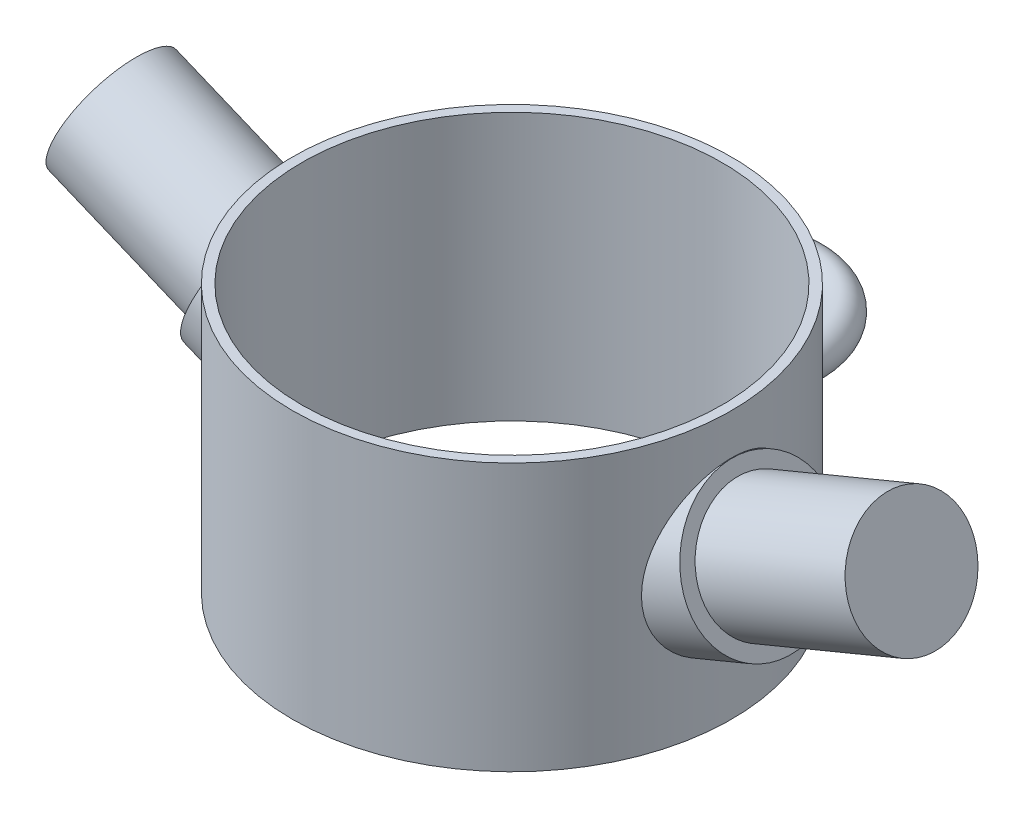
ISO-10303-21;
HEADER;
FILE_DESCRIPTION(('STEP AP214'),'2;1');
FILE_NAME('part.step','',(''),(''),'','','');
FILE_SCHEMA(('AUTOMOTIVE_DESIGN { 1 0 10303 214 1 1 1 1 }'));
ENDSEC;
DATA;
#1=APPLICATION_CONTEXT('core data for automotive mechanical design processes');
#2=APPLICATION_PROTOCOL_DEFINITION('international standard','automotive_design',2000,#1);
#3=PRODUCT_CONTEXT('',#1,'mechanical');
#4=PRODUCT('Part','Part','',(#3));
#5=PRODUCT_RELATED_PRODUCT_CATEGORY('part','',(#4));
#6=PRODUCT_DEFINITION_FORMATION('','',#4);
#7=PRODUCT_DEFINITION_CONTEXT('part definition',#1,'design');
#8=PRODUCT_DEFINITION('design','',#6,#7);
#9=PRODUCT_DEFINITION_SHAPE('','',#8);
#10=(LENGTH_UNIT() NAMED_UNIT(*) SI_UNIT(.MILLI.,.METRE.));
#11=(NAMED_UNIT(*) PLANE_ANGLE_UNIT() SI_UNIT($,.RADIAN.));
#12=(NAMED_UNIT(*) SI_UNIT($,.STERADIAN.) SOLID_ANGLE_UNIT());
#13=UNCERTAINTY_MEASURE_WITH_UNIT(LENGTH_MEASURE(1.E-05),#10,'distance_accuracy_value','');
#14=(GEOMETRIC_REPRESENTATION_CONTEXT(3) GLOBAL_UNCERTAINTY_ASSIGNED_CONTEXT((#13)) GLOBAL_UNIT_ASSIGNED_CONTEXT((#10,
#11,#12)) REPRESENTATION_CONTEXT('',''));
#15=CARTESIAN_POINT('',(0.,0.,0.));
#16=DIRECTION('',(0.,0.,1.));
#17=DIRECTION('',(1.,0.,0.));
#18=AXIS2_PLACEMENT_3D('',#15,#16,#17);
#19=CARTESIAN_POINT('',(0.,28.,0.));
#20=DIRECTION('',(0.,-1.,0.));
#21=DIRECTION('',(0.,0.,-1.));
#22=AXIS2_PLACEMENT_3D('',#19,#20,#21);
#23=CYLINDRICAL_SURFACE('',#22,23.);
#24=CARTESIAN_POINT('',(-9.45863752450788,12.9072154425259,-20.9650703833775));
#25=CARTESIAN_POINT('',(-9.40091763509422,12.8123335720071,-20.99111129922));
#26=CARTESIAN_POINT('',(-9.33563169768489,12.7228074473766,-21.0202797447555));
#27=CARTESIAN_POINT('',(-9.19180981937439,12.5570031617671,-21.0835670020128));
#28=CARTESIAN_POINT('',(-9.11325565246891,12.4807435209313,-21.1176926140337));
#29=CARTESIAN_POINT('',(-8.94521860650558,12.3436602258101,-21.1894168060768));
#30=CARTESIAN_POINT('',(-8.85574892829023,12.2828181948299,-21.2270111779436));
#31=CARTESIAN_POINT('',(-8.66825501265404,12.1780470063948,-21.3042630315511));
#32=CARTESIAN_POINT('',(-8.57023292681641,12.1341136100915,-21.3439199933849));
#33=CARTESIAN_POINT('',(-8.3670643867085,12.0638705351019,-21.4243855729708));
#34=CARTESIAN_POINT('',(-8.26184899333641,12.0377692333265,-21.4652021887685));
#35=CARTESIAN_POINT('',(-8.04820904303431,12.0047396724874,-21.5462149798191));
#36=CARTESIAN_POINT('',(-7.93978424859824,11.9978128359995,-21.5864111088175));
#37=CARTESIAN_POINT('',(-7.72245043609984,12.0033985605864,-21.6651137751999));
#38=CARTESIAN_POINT('',(-7.61354093700662,12.0159690039359,-21.703614931401));
#39=CARTESIAN_POINT('',(-7.39873083687004,12.0604053461977,-21.777779896589));
#40=CARTESIAN_POINT('',(-7.29283012855954,12.0922705563215,-21.8134438068092));
#41=CARTESIAN_POINT('',(-7.08799816496133,12.1741892177065,-21.8808553417927));
#42=CARTESIAN_POINT('',(-6.98902020014023,12.2241030904326,-21.9126305813293));
#43=CARTESIAN_POINT('',(-6.8001868451411,12.3408343574743,-21.9719654526679));
#44=CARTESIAN_POINT('',(-6.71033089125231,12.4076507063795,-21.9995253450182));
#45=CARTESIAN_POINT('',(-6.54351107787697,12.5554950227802,-22.0497161200074));
#46=CARTESIAN_POINT('',(-6.46641293061678,12.6363537502184,-22.0723992133737));
#47=CARTESIAN_POINT('',(-6.32630831580525,12.8105264483493,-22.1129635567075));
#48=CARTESIAN_POINT('',(-6.26330110871728,12.9038397649757,-22.1308450586876));
#49=CARTESIAN_POINT('',(-6.15392215663227,13.0992899864054,-22.1615083041289));
#50=CARTESIAN_POINT('',(-6.10739384897829,13.2013317442628,-22.1743381803193));
#51=CARTESIAN_POINT('',(-6.03158919861628,13.4121041392754,-22.1950779820422));
#52=CARTESIAN_POINT('',(-6.00231221145424,13.5208345263972,-22.2029880913622));
#53=CARTESIAN_POINT('',(-5.96206441699237,13.741169528852,-22.2138295777069));
#54=CARTESIAN_POINT('',(-5.95098079655635,13.8527520407072,-22.2167916385523));
#55=CARTESIAN_POINT('',(-5.94711575018189,14.0762552695937,-22.2178266065175));
#56=CARTESIAN_POINT('',(-5.9543339779185,14.1881759801853,-22.2158996061529));
#57=CARTESIAN_POINT('',(-5.98680702761917,14.4089067768686,-22.2071704308341));
#58=CARTESIAN_POINT('',(-6.01201998343204,14.5177234746835,-22.2003795719001));
#59=CARTESIAN_POINT('',(-6.0796478484133,14.7294384379774,-22.181954403037));
#60=CARTESIAN_POINT('',(-6.12206273309776,14.8323367118802,-22.1703201000016));
#61=CARTESIAN_POINT('',(-6.22285693391416,15.0294854048628,-22.1422397265419));
#62=CARTESIAN_POINT('',(-6.28126167304933,15.1237217304803,-22.1257859905439));
#63=CARTESIAN_POINT('',(-6.41220087978032,15.3007446609825,-22.0881937945027));
#64=CARTESIAN_POINT('',(-6.48473560568336,15.3835310565061,-22.0670552488166));
#65=CARTESIAN_POINT('',(-6.64215480557748,15.535817325805,-22.0201849478844));
#66=CARTESIAN_POINT('',(-6.72710450193285,15.6052422422827,-21.9944287608292));
#67=CARTESIAN_POINT('',(-6.90649047438225,15.7283891378304,-21.9387601517315));
#68=CARTESIAN_POINT('',(-7.00092714030287,15.7821104712736,-21.90884755888));
#69=CARTESIAN_POINT('',(-7.19739435748594,15.8728830049841,-21.8450970323289));
#70=CARTESIAN_POINT('',(-7.29948591166424,15.9097789020999,-21.8112260168199));
#71=CARTESIAN_POINT('',(-7.50753085600751,15.9652762360575,-21.7404932884201));
#72=CARTESIAN_POINT('',(-7.61348448773836,15.9838765264992,-21.7036313882775));
#73=CARTESIAN_POINT('',(-7.82746487128875,16.0024812809065,-21.6273861902494));
#74=CARTESIAN_POINT('',(-7.93550154567877,16.0022747891439,-21.5879792455297));
#75=CARTESIAN_POINT('',(-8.14945672333937,15.982820706427,-21.5081240294153));
#76=CARTESIAN_POINT('',(-8.25537509131455,15.9635719031851,-21.4676756918822));
#77=CARTESIAN_POINT('',(-8.46314469892419,15.9063226771514,-21.3866251089105));
#78=CARTESIAN_POINT('',(-8.5649502001911,15.8681533424656,-21.3460248082035));
#79=CARTESIAN_POINT('',(-8.76066516309959,15.7740103227136,-21.2664505046227));
#80=CARTESIAN_POINT('',(-8.85457440942133,15.7180361523333,-21.2274765461115));
#81=CARTESIAN_POINT('',(-9.03191644641354,15.5897552036912,-21.152630165264));
#82=CARTESIAN_POINT('',(-9.11534794764352,15.5174464182735,-21.1167581248332));
#83=CARTESIAN_POINT('',(-9.26936499939917,15.3584373823157,-21.0496067867917));
#84=CARTESIAN_POINT('',(-9.33995131979611,15.2717379948669,-21.0183272139548));
#85=CARTESIAN_POINT('',(-9.46539031631106,15.0875666783766,-20.9621340311031));
#86=CARTESIAN_POINT('',(-9.52043725980906,14.9902510017912,-20.937142287022));
#87=CARTESIAN_POINT('',(-9.61437668630638,14.7866870042962,-20.8941724816237));
#88=CARTESIAN_POINT('',(-9.65327190495502,14.6804401997377,-20.8761932326177));
#89=CARTESIAN_POINT('',(-9.71307351404048,14.4644507878549,-20.8484357685195));
#90=CARTESIAN_POINT('',(-9.73434461400344,14.3548304485853,-20.8384913954088));
#91=CARTESIAN_POINT('',(-9.75962502658742,14.1331646606827,-20.8266636824497));
#92=CARTESIAN_POINT('',(-9.76363202176739,14.0211188885011,-20.8247814248167));
#93=CARTESIAN_POINT('',(-9.75432931730409,13.7995849442662,-20.8291401830716));
#94=CARTESIAN_POINT('',(-9.74127437681367,13.6900834337021,-20.8352616918254));
#95=CARTESIAN_POINT('',(-9.69868316913403,13.4751441643532,-20.8551215007782));
#96=CARTESIAN_POINT('',(-9.66916610480702,13.3697018235146,-20.8688509263175));
#97=CARTESIAN_POINT('',(-9.6087850547548,13.2046023025529,-20.896695439883));
#98=CARTESIAN_POINT('',(-9.58270156122075,13.1427818820474,-20.9086785359706));
#99=CARTESIAN_POINT('',(-9.52485666016338,13.0224099050084,-20.9350930295937));
#100=CARTESIAN_POINT('',(-9.49309531952717,12.9638583099776,-20.9495243982876));
#101=CARTESIAN_POINT('',(-9.45863752450788,12.9072154425259,-20.9650703833775));
#102=B_SPLINE_CURVE_WITH_KNOTS('',3,(#24,#25,#26,#27,#28,#29,#30,#31,#32,#33,#34,#35,#36,#37,
#38,#39,#40,#41,#42,#43,#44,#45,#46,#47,#48,#49,#50,#51,#52,#53,#54,#55,#56,#57,#58,#59,#60,#61,
#62,#63,#64,#65,#66,#67,#68,#69,#70,#71,#72,#73,#74,#75,#76,#77,#78,#79,#80,#81,#82,#83,#84,#85,
#86,#87,#88,#89,#90,#91,#92,#93,#94,#95,#96,#97,#98,#99,#100,#101),.UNSPECIFIED.,.T.,.F.,(4,2,2,
2,2,2,2,2,2,2,2,2,2,2,2,2,2,2,2,2,2,2,2,2,2,2,2,2,2,2,2,2,2,2,2,2,2,2,4),(0.,0.341960274113529,
0.684394162751292,1.02641795407866,1.36835594706461,1.71422428122776,2.06011827507362,
2.4070411039759,2.75395154908829,3.09823462763754,3.44249641763902,3.78286548778349,
4.12321669009953,4.46024159149229,4.79725390191715,5.13216846721425,5.46707669498725,
5.80120826184532,6.13533935312696,6.470004811294,6.80467638798166,7.14117397181726,
7.47768538824681,7.81724296799636,8.15682182301798,8.50021019902661,8.84362043752418,
9.19015321125396,9.53669543138554,9.88328025692431,10.2298443031808,10.571861621364,
10.913820987753,11.2485134967864,11.5832509317521,11.913046908575,12.2424589847083,
12.4466058732877,12.6507503571016),.UNSPECIFIED.);
#103=CARTESIAN_POINT('',(-9.45863752450788,12.9072154425259,-20.9650703833775));
#104=VERTEX_POINT('',#103);
#105=EDGE_CURVE('E127',#104,#104,#102,.T.);
#106=ORIENTED_EDGE('',*,*,#105,.T.);
#107=EDGE_LOOP('',(#106));
#108=FACE_BOUND('',#107,.T.);
#109=CARTESIAN_POINT('',(6.10269352421878,13.2205785626727,-22.1755976380828));
#110=CARTESIAN_POINT('',(6.14521089020816,13.1173204777489,-22.1638971972689));
#111=CARTESIAN_POINT('',(6.19617737951456,13.0177333373527,-22.1497429297276));
#112=CARTESIAN_POINT('',(6.31342064255904,12.8288021229089,-22.116609499394));
#113=CARTESIAN_POINT('',(6.37971540088063,12.7394702670422,-22.0976246662731));
#114=CARTESIAN_POINT('',(6.52547662311288,12.5736884636725,-22.0550198621116));
#115=CARTESIAN_POINT('',(6.60493288823996,12.4972286334896,-22.0314034774499));
#116=CARTESIAN_POINT('',(6.77460095877771,12.3592112522151,-21.9798232044348));
#117=CARTESIAN_POINT('',(6.86481033814351,12.2976503491903,-21.9518602962836));
#118=CARTESIAN_POINT('',(7.05388970566864,12.1906872234488,-21.891836962247));
#119=CARTESIAN_POINT('',(7.1528095162291,12.145386641388,-21.8597524083713));
#120=CARTESIAN_POINT('',(7.35592868950809,12.0726160254498,-21.7922408528646));
#121=CARTESIAN_POINT('',(7.46012854325325,12.045147653202,-21.756813540103));
#122=CARTESIAN_POINT('',(7.67199378128259,12.008485276102,-21.6830169763665));
#123=CARTESIAN_POINT('',(7.77968461941921,11.9994946709492,-21.6446197587793));
#124=CARTESIAN_POINT('',(7.99439492324284,12.0005493530565,-21.566240156087));
#125=CARTESIAN_POINT('',(8.10141434424232,12.0105958941658,-21.5262576667405));
#126=CARTESIAN_POINT('',(8.31292043122307,12.0496006248061,-21.4454727526869));
#127=CARTESIAN_POINT('',(8.41737020512885,12.0787503650325,-21.4046661244972));
#128=CARTESIAN_POINT('',(8.61972086701476,12.1553455662055,-21.3239838401549));
#129=CARTESIAN_POINT('',(8.71762150700506,12.2027917195052,-21.284108219293));
#130=CARTESIAN_POINT('',(8.90446495075166,12.3148886245983,-21.2066209934306));
#131=CARTESIAN_POINT('',(8.99338084433315,12.3795890645826,-21.1690163180126));
#132=CARTESIAN_POINT('',(9.15944439045123,12.5244101308792,-21.0976955957442));
#133=CARTESIAN_POINT('',(9.23659247898882,12.6045301856408,-21.0639794048354));
#134=CARTESIAN_POINT('',(9.37620496642932,12.7771396067857,-21.0022038248282));
#135=CARTESIAN_POINT('',(9.43880810511043,12.8694976743955,-20.974091384292));
#136=CARTESIAN_POINT('',(9.54846912555955,13.0646172259008,-20.9243966955928));
#137=CARTESIAN_POINT('',(9.59552891252909,13.1673774327518,-20.9028136471272));
#138=CARTESIAN_POINT('',(9.67188628727338,13.3781546180583,-20.867591089076));
#139=CARTESIAN_POINT('',(9.70152505914162,13.4860225350285,-20.8537992178846));
#140=CARTESIAN_POINT('',(9.74360541655599,13.7057600123819,-20.8341714788572));
#141=CARTESIAN_POINT('',(9.75604908333242,13.8176290867985,-20.8283346481744));
#142=CARTESIAN_POINT('',(9.76329212648495,14.0400368484067,-20.8249403587113));
#143=CARTESIAN_POINT('',(9.75840517743686,14.150563219874,-20.827235711177));
#144=CARTESIAN_POINT('',(9.7318307965217,14.3691220075188,-20.8396660419808));
#145=CARTESIAN_POINT('',(9.7101439265098,14.4771545069767,-20.8498007581399));
#146=CARTESIAN_POINT('',(9.65069586367749,14.6873909929171,-20.877383219232));
#147=CARTESIAN_POINT('',(9.61297848464872,14.7896100114126,-20.8948110290593));
#148=CARTESIAN_POINT('',(9.5225576413069,14.9857622365519,-20.9361733866338));
#149=CARTESIAN_POINT('',(9.46985324010506,15.0796949247084,-20.96010834116));
#150=CARTESIAN_POINT('',(9.35005798271434,15.258084365683,-21.0138233550073));
#151=CARTESIAN_POINT('',(9.28277233034085,15.342386548417,-21.0436820437224));
#152=CARTESIAN_POINT('',(9.13610507818063,15.4977676808664,-21.1077705411376));
#153=CARTESIAN_POINT('',(9.05672215448355,15.5688451813959,-21.1420008281934));
#154=CARTESIAN_POINT('',(8.88617182824437,15.6973324214307,-21.2142567801129));
#155=CARTESIAN_POINT('',(8.79479217915685,15.7544242254651,-21.2523469910646));
#156=CARTESIAN_POINT('',(8.60404340676591,15.8515027079371,-21.3302846825979));
#157=CARTESIAN_POINT('',(8.50467357313757,15.8914878635974,-21.3701323192715));
#158=CARTESIAN_POINT('',(8.29911176845899,15.9537567390029,-21.4508064885004));
#159=CARTESIAN_POINT('',(8.19284197766035,15.9757763787351,-21.4916388463159));
#160=CARTESIAN_POINT('',(7.97774289315103,16.000505446476,-21.5724086287642));
#161=CARTESIAN_POINT('',(7.86891354703863,16.0032144787932,-21.6123460350419));
#162=CARTESIAN_POINT('',(7.65160185815844,15.9891628217385,-21.6902358924939));
#163=CARTESIAN_POINT('',(7.54312033330042,15.9723714209003,-21.7281851139666));
#164=CARTESIAN_POINT('',(7.32985501118631,15.9196346867232,-21.8010533861837));
#165=CARTESIAN_POINT('',(7.22507107808052,15.8836900578576,-21.8359725483216));
#166=CARTESIAN_POINT('',(7.02321342543521,15.7939368414584,-21.9017273144099));
#167=CARTESIAN_POINT('',(6.92608277488744,15.7402794798655,-21.9325944971733));
#168=CARTESIAN_POINT('',(6.74155403078518,15.6164568256508,-21.9900159005802));
#169=CARTESIAN_POINT('',(6.65415536642108,15.5462925019629,-22.0165703742187));
#170=CARTESIAN_POINT('',(6.49276104112356,15.3922876891027,-22.0647021742976));
#171=CARTESIAN_POINT('',(6.41862489894083,15.308610950001,-22.0863324234804));
#172=CARTESIAN_POINT('',(6.28488602853546,15.1293807466616,-22.1247613215728));
#173=CARTESIAN_POINT('',(6.22528201619414,15.0338283329347,-22.1415603974082));
#174=CARTESIAN_POINT('',(6.12299218299915,14.8345400196241,-22.1700647625045));
#175=CARTESIAN_POINT('',(6.08015044575975,14.7308908497779,-22.1818170998825));
#176=CARTESIAN_POINT('',(6.01192626569372,14.5175503686839,-22.2004054764128));
#177=CARTESIAN_POINT('',(5.98654730837976,14.4078578559213,-22.2072405341047));
#178=CARTESIAN_POINT('',(5.95415218146185,14.1862149032075,-22.2159481816982));
#179=CARTESIAN_POINT('',(5.94703842518813,14.0742796965311,-22.2178471446691));
#180=CARTESIAN_POINT('',(5.95112687958976,13.8508571437557,-22.2167526902381));
#181=CARTESIAN_POINT('',(5.96230785495518,13.7393694287753,-22.2137649450041));
#182=CARTESIAN_POINT('',(5.99529923476997,13.5595320495561,-22.2048765624216));
#183=CARTESIAN_POINT('',(6.0118363656488,13.490096774525,-22.200411134071));
#184=CARTESIAN_POINT('',(6.05200654937714,13.353471757224,-22.1894941839038));
#185=CARTESIAN_POINT('',(6.07563958892186,13.286282010744,-22.1830426658112));
#186=CARTESIAN_POINT('',(6.10269352421878,13.2205785626727,-22.1755976380828));
#187=B_SPLINE_CURVE_WITH_KNOTS('',3,(#109,#110,#111,#112,#113,#114,#115,#116,#117,#118,#119,
#120,#121,#122,#123,#124,#125,#126,#127,#128,#129,#130,#131,#132,#133,#134,#135,#136,#137,#138,
#139,#140,#141,#142,#143,#144,#145,#146,#147,#148,#149,#150,#151,#152,#153,#154,#155,#156,#157,
#158,#159,#160,#161,#162,#163,#164,#165,#166,#167,#168,#169,#170,#171,#172,#173,#174,#175,#176,
#177,#178,#179,#180,#181,#182,#183,#184,#185,#186),.UNSPECIFIED.,.T.,.F.,(4,2,2,2,2,2,2,2,2,2,2,
2,2,2,2,2,2,2,2,2,2,2,2,2,2,2,2,2,2,2,2,2,2,2,2,2,2,2,4),(0.,0.336578300381109,
0.673553528585848,1.01026884759254,1.34690834244152,1.68561690417229,2.02435702269939,
2.36680637872215,2.70927829037201,3.05523787067799,3.40121054369924,3.74819049971972,
4.09515759689548,4.43866511585022,4.78213051427989,5.11862347157278,5.45507569746582,
5.78546964876733,6.11585255087745,6.44533821557307,6.77484448204739,7.10905878415221,
7.44330968855686,7.7845711762926,8.12586303568145,8.4720855717589,8.81831520222354,
9.16509085419993,9.51185375232974,9.85572952402926,10.1995851157679,10.5395495044921,
10.8794838416707,11.2161764654901,11.5529362725562,11.8878930713344,12.222461350235,
12.4366275955362,12.6507934392794),.UNSPECIFIED.);
#188=CARTESIAN_POINT('',(6.10269352421878,13.2205785626727,-22.1755976380828));
#189=VERTEX_POINT('',#188);
#190=EDGE_CURVE('E131',#189,#189,#187,.T.);
#191=ORIENTED_EDGE('',*,*,#190,.T.);
#192=EDGE_LOOP('',(#191));
#193=FACE_BOUND('',#192,.T.);
#194=CARTESIAN_POINT('',(-21.6067297433056,15.9480329259328,7.88347828054052));
#195=CARTESIAN_POINT('',(-21.5932349089745,15.7104631731292,7.92046393771553));
#196=CARTESIAN_POINT('',(-21.58276190284,15.4713904992183,7.94888751266727));
#197=CARTESIAN_POINT('',(-21.5683475675663,14.9915124358502,7.98791742053008));
#198=CARTESIAN_POINT('',(-21.5644079755596,14.7507066026605,7.9985190148656));
#199=CARTESIAN_POINT('',(-21.5634160957091,14.2687209786723,8.00119319773821));
#200=CARTESIAN_POINT('',(-21.5663706326949,14.0275410537075,7.99324742534318));
#201=CARTESIAN_POINT('',(-21.5793417574891,13.5467723449696,7.95816324407381));
#202=CARTESIAN_POINT('',(-21.5893577747819,13.3071834342327,7.93102638569707));
#203=CARTESIAN_POINT('',(-21.6164430809111,12.8303624528324,7.85690484233437));
#204=CARTESIAN_POINT('',(-21.63354419212,12.5931460250687,7.80983058793829));
#205=CARTESIAN_POINT('',(-21.6744643508277,12.1241859283535,7.69553609753016));
#206=CARTESIAN_POINT('',(-21.6982835931898,11.8924424183584,7.62831527715196));
#207=CARTESIAN_POINT('',(-21.7520031784572,11.4366293537229,7.47375674864439));
#208=CARTESIAN_POINT('',(-21.7819000607076,11.2125555163702,7.38643048497444));
#209=CARTESIAN_POINT('',(-21.84689120273,10.7739865173954,7.19192926177118));
#210=CARTESIAN_POINT('',(-21.8819850636011,10.5594906222489,7.08475582547583));
#211=CARTESIAN_POINT('',(-21.9532854825649,10.1586176916081,6.86046392394433));
#212=CARTESIAN_POINT('',(-21.9891813943811,9.9713612192946,6.74481500316963));
#213=CARTESIAN_POINT('',(-22.0634057973248,9.6079631571336,6.49790230558399));
#214=CARTESIAN_POINT('',(-22.1017341582338,9.43182097330018,6.36663936432369));
#215=CARTESIAN_POINT('',(-22.1797286409331,9.09187263630204,6.08936530674504));
#216=CARTESIAN_POINT('',(-22.2193947861191,8.92806669904011,5.94335393241167));
#217=CARTESIAN_POINT('',(-22.298930601697,8.61385937757604,5.63760909603257));
#218=CARTESIAN_POINT('',(-22.338800272863,8.46345804439935,5.47787558175721));
#219=CARTESIAN_POINT('',(-22.4167173891902,8.18023214121285,5.14961961042238));
#220=CARTESIAN_POINT('',(-22.4547856548372,8.04708567731107,4.98137957142715));
#221=CARTESIAN_POINT('',(-22.5290390193817,7.79513171525256,4.63399965567075));
#222=CARTESIAN_POINT('',(-22.5652234303254,7.6763294347603,4.45485584811412));
#223=CARTESIAN_POINT('',(-22.6347335274555,7.45375783692257,4.08703451931264));
#224=CARTESIAN_POINT('',(-22.6680603171921,7.34998270566249,3.89836072347672));
#225=CARTESIAN_POINT('',(-22.7310292351049,7.15785314775371,3.51262219572008));
#226=CARTESIAN_POINT('',(-22.7606696819078,7.06950575045975,3.31555368951307));
#227=CARTESIAN_POINT('',(-22.8160244430773,6.90714009315577,2.91059820728808));
#228=CARTESIAN_POINT('',(-22.8416526212938,6.83342891820173,2.70257627480771));
#229=CARTESIAN_POINT('',(-22.8876108016398,6.70284862382345,2.28084291337268));
#230=CARTESIAN_POINT('',(-22.9079430741935,6.64597228565356,2.06713396596905));
#231=CARTESIAN_POINT('',(-22.9428122368444,6.54924107925384,1.63532972991288));
#232=CARTESIAN_POINT('',(-22.9573464505994,6.50939407103707,1.41723246432242));
#233=CARTESIAN_POINT('',(-22.9802330236604,6.44693952394851,0.978345138765568));
#234=CARTESIAN_POINT('',(-22.9885876290163,6.42432572137912,0.757556086847809));
#235=CARTESIAN_POINT('',(-22.9989709394602,6.39625075167065,0.312239720955852));
#236=CARTESIAN_POINT('',(-23.000927280538,6.39098579401411,0.0876983217221244));
#237=CARTESIAN_POINT('',(-22.9982604519909,6.39818114026983,-0.36106245175302));
#238=CARTESIAN_POINT('',(-22.9936372251499,6.41064159832286,-0.5852818231771));
#239=CARTESIAN_POINT('',(-22.9779300344259,6.45323562700369,-1.03181548347489));
#240=CARTESIAN_POINT('',(-22.9668458524836,6.48336979412513,-1.25412970779228));
#241=CARTESIAN_POINT('',(-22.9385030758933,6.56118248693136,-1.6952668006425));
#242=CARTESIAN_POINT('',(-22.9212444881975,6.60886099286205,-1.91408967310613));
#243=CARTESIAN_POINT('',(-22.8809807052147,6.7216145054055,-2.34691577028144));
#244=CARTESIAN_POINT('',(-22.8579694616649,6.78670782680142,-2.56091366226869));
#245=CARTESIAN_POINT('',(-22.8068037963378,6.934011159434,-2.98241415659355));
#246=CARTESIAN_POINT('',(-22.7786470268067,7.01622898648725,-3.18991374311172));
#247=CARTESIAN_POINT('',(-22.7179487919159,7.19738405851377,-3.59682103310771));
#248=CARTESIAN_POINT('',(-22.685407259462,7.29632155933199,-3.79622861270347));
#249=CARTESIAN_POINT('',(-22.6168388880739,7.51038458370448,-4.18540618183451));
#250=CARTESIAN_POINT('',(-22.580813701043,7.62550244637404,-4.3751806747826));
#251=CARTESIAN_POINT('',(-22.5064496534759,7.87074120936373,-4.74286100388664));
#252=CARTESIAN_POINT('',(-22.4681235234638,8.00078263754227,-4.92082241109041));
#253=CARTESIAN_POINT('',(-22.39005954596,8.27562612824857,-5.26462857109673));
#254=CARTESIAN_POINT('',(-22.3503217033496,8.42042813974133,-5.4304733657893));
#255=CARTESIAN_POINT('',(-22.2705670720195,8.72390975478489,-5.74880589961997));
#256=CARTESIAN_POINT('',(-22.23055033891,8.88258666067638,-5.9012962237438));
#257=CARTESIAN_POINT('',(-22.1513781427515,9.212831310694,-6.19185986762837));
#258=CARTESIAN_POINT('',(-22.1122226639887,9.38439881937368,-6.32993345060041));
#259=CARTESIAN_POINT('',(-22.0366118550472,9.73594772709207,-6.58828688592067));
#260=CARTESIAN_POINT('',(-22.0001198297144,9.91571305058704,-6.70885012330034));
#261=CARTESIAN_POINT('',(-21.9300576520726,10.2852747887143,-6.93444516857016));
#262=CARTESIAN_POINT('',(-21.8964874504134,10.4750710338351,-7.03947723880596));
#263=CARTESIAN_POINT('',(-21.8331760040893,10.8632890634618,-7.2334528792194));
#264=CARTESIAN_POINT('',(-21.8034342402076,11.0617096734291,-7.32239863170467));
#265=CARTESIAN_POINT('',(-21.7485360068956,11.4657276953262,-7.48388002296136));
#266=CARTESIAN_POINT('',(-21.7233795516738,11.6713251294924,-7.55641561088273));
#267=CARTESIAN_POINT('',(-21.678371488399,12.0869908050781,-7.68458195381368));
#268=CARTESIAN_POINT('',(-21.6584906557968,12.297027148498,-7.7403060825281));
#269=CARTESIAN_POINT('',(-21.6242397134221,12.7212641710822,-7.83548448484708));
#270=CARTESIAN_POINT('',(-21.6098715763263,12.9354663121907,-7.87493293470195));
#271=CARTESIAN_POINT('',(-21.586872227171,13.3664752819855,-7.93776211626069));
#272=CARTESIAN_POINT('',(-21.5782401628436,13.583281718849,-7.9611452349753));
#273=CARTESIAN_POINT('',(-21.5667459561659,14.0182321091344,-7.99222973055143));
#274=CARTESIAN_POINT('',(-21.5638860181692,14.2363765416442,-7.99992511633702));
#275=CARTESIAN_POINT('',(-21.563829959448,14.686660440424,-8.00007853530111));
#276=CARTESIAN_POINT('',(-21.5670085060414,14.9188009853926,-7.99152859663955));
#277=CARTESIAN_POINT('',(-21.5794744919767,15.381717360571,-7.95779756028312));
#278=CARTESIAN_POINT('',(-21.5887641952111,15.6124926530404,-7.93261029923814));
#279=CARTESIAN_POINT('',(-21.6252076140638,16.3009457647316,-7.83299464717093));
#280=CARTESIAN_POINT('',(-21.6609363394703,16.754983398889,-7.73451128750672));
#281=CARTESIAN_POINT('',(-21.7312041486965,17.4504180498045,-7.53395197888261));
#282=CARTESIAN_POINT('',(-21.7595282321751,17.6985707370184,-7.45198987944617));
#283=CARTESIAN_POINT('',(-21.8210880554409,18.1874436510986,-7.2697587938211));
#284=CARTESIAN_POINT('',(-21.8543242351269,18.4281632099607,-7.16948816783777));
#285=CARTESIAN_POINT('',(-21.9600517378613,19.1377690688165,-6.84171801916707));
#286=CARTESIAN_POINT('',(-22.0385349508468,19.5938506815163,-6.58733316225206));
#287=CARTESIAN_POINT('',(-22.1653367350415,20.2620760586951,-6.14202171130592));
#288=CARTESIAN_POINT('',(-22.211162411704,20.4909163456461,-5.97476267198905));
#289=CARTESIAN_POINT('',(-22.3034967674251,20.9326690583751,-5.62028446795678));
#290=CARTESIAN_POINT('',(-22.3500055706469,21.145578544664,-5.43306163497958));
#291=CARTESIAN_POINT('',(-22.4420189595965,21.5524763131549,-5.03949958971981));
#292=CARTESIAN_POINT('',(-22.4875250955732,21.7464956625082,-4.83319289172391));
#293=CARTESIAN_POINT('',(-22.5759183580905,22.1130912314262,-4.40185254173129));
#294=CARTESIAN_POINT('',(-22.618806756328,22.2856779058287,-4.17682811038912));
#295=CARTESIAN_POINT('',(-22.6877775983594,22.557266805626,-3.78047295732109));
#296=CARTESIAN_POINT('',(-22.7149968443383,22.6626597136589,-3.61369248305053));
#297=CARTESIAN_POINT('',(-22.7667051820554,22.8603323435135,-3.27214666650795));
#298=CARTESIAN_POINT('',(-22.7911949844873,22.9526154805895,-3.09738341958112));
#299=CARTESIAN_POINT('',(-22.836829858478,23.1228109351324,-2.74071121432177));
#300=CARTESIAN_POINT('',(-22.8579773208203,23.2007335314127,-2.55880748093295));
#301=CARTESIAN_POINT('',(-22.896379619735,23.3411114011047,-2.1886993338168));
#302=CARTESIAN_POINT('',(-22.9136343427415,23.4035662232679,-2.00049473645329));
#303=CARTESIAN_POINT('',(-22.9438459479778,23.512298477582,-1.61772346233316));
#304=CARTESIAN_POINT('',(-22.9567728902577,23.5584633282162,-1.42312229590699));
#305=CARTESIAN_POINT('',(-22.977754193503,23.6331330925799,-1.03028790043941));
#306=CARTESIAN_POINT('',(-22.9858085695578,23.6616380609993,-0.832054682647842));
#307=CARTESIAN_POINT('',(-22.9967728668633,23.7003936522378,-0.433727496683572));
#308=CARTESIAN_POINT('',(-22.9996844131926,23.7106500414182,-0.233634136393655));
#309=CARTESIAN_POINT('',(-23.0002668100657,23.7127039234934,0.16664563312885));
#310=CARTESIAN_POINT('',(-22.9979380978785,23.7045029565464,0.366832033204205));
#311=CARTESIAN_POINT('',(-22.9886404911154,23.6716536366052,0.744484350607227));
#312=CARTESIAN_POINT('',(-22.9821855794196,23.6488265348499,0.922124750764588));
#313=CARTESIAN_POINT('',(-22.9653202341284,23.5889164534079,1.27485260817584));
#314=CARTESIAN_POINT('',(-22.9549084824193,23.5518287231322,1.44993919449219));
#315=CARTESIAN_POINT('',(-22.9304025186591,23.4639924355984,1.79632548157816));
#316=CARTESIAN_POINT('',(-22.9163092828322,23.4132474997324,1.96762617321746));
#317=CARTESIAN_POINT('',(-22.8847785090565,23.2988087325158,2.30558773330531));
#318=CARTESIAN_POINT('',(-22.8673396712981,23.2351098678167,2.47224676949672));
#319=CARTESIAN_POINT('',(-22.8289160045891,23.0933856918038,2.80527579985553));
#320=CARTESIAN_POINT('',(-22.8078361055787,23.0149694572351,2.9714683274796));
#321=CARTESIAN_POINT('',(-22.7630112045326,22.8462058528776,3.29733342903973));
#322=CARTESIAN_POINT('',(-22.7392652544157,22.755854236687,3.45700365585927));
#323=CARTESIAN_POINT('',(-22.6647668476084,22.4683820417948,3.92532041821636));
#324=CARTESIAN_POINT('',(-22.6107310341694,22.2547618335278,4.22346269831282));
#325=CARTESIAN_POINT('',(-22.4882471454598,21.7516755404276,4.83659485806412));
#326=CARTESIAN_POINT('',(-22.4189104315172,21.4554894347692,5.14583655734253));
#327=CARTESIAN_POINT('',(-22.2793205352728,20.8226402906317,5.72008027610531));
#328=CARTESIAN_POINT('',(-22.2090663233342,20.4859275253503,5.98502697329116));
#329=CARTESIAN_POINT('',(-22.1000978229316,19.9208489900572,6.37248142584995));
#330=CARTESIAN_POINT('',(-22.0599560748931,19.7026773420933,6.50972001737099));
#331=CARTESIAN_POINT('',(-21.9823269152836,19.2560767691543,6.7672265065588));
#332=CARTESIAN_POINT('',(-21.9448400868386,19.0276456086753,6.88749068169153));
#333=CARTESIAN_POINT('',(-21.8380441382136,18.3296531059531,7.22183397399073));
#334=CARTESIAN_POINT('',(-21.774197531613,17.8463836488033,7.41015088981824));
#335=CARTESIAN_POINT('',(-21.6972118007299,17.1219086268519,7.63127150669086));
#336=CARTESIAN_POINT('',(-21.6752529735964,16.8900565869756,7.69328409650258));
#337=CARTESIAN_POINT('',(-21.6367631763976,16.4219830175686,7.80088439066288));
#338=CARTESIAN_POINT('',(-21.6202335385224,16.1857604306104,7.84646806402387));
#339=CARTESIAN_POINT('',(-21.6067297433056,15.9480329259328,7.88347828054052));
#340=B_SPLINE_CURVE_WITH_KNOTS('',3,(#194,#195,#196,#197,#198,#199,#200,#201,#202,#203,#204,
#205,#206,#207,#208,#209,#210,#211,#212,#213,#214,#215,#216,#217,#218,#219,#220,#221,#222,#223,
#224,#225,#226,#227,#228,#229,#230,#231,#232,#233,#234,#235,#236,#237,#238,#239,#240,#241,#242,
#243,#244,#245,#246,#247,#248,#249,#250,#251,#252,#253,#254,#255,#256,#257,#258,#259,#260,#261,
#262,#263,#264,#265,#266,#267,#268,#269,#270,#271,#272,#273,#274,#275,#276,#277,#278,#279,#280,
#281,#282,#283,#284,#285,#286,#287,#288,#289,#290,#291,#292,#293,#294,#295,#296,#297,#298,#299,
#300,#301,#302,#303,#304,#305,#306,#307,#308,#309,#310,#311,#312,#313,#314,#315,#316,#317,#318,
#319,#320,#321,#322,#323,#324,#325,#326,#327,#328,#329,#330,#331,#332,#333,#334,#335,#336,#337,
#338,#339),.UNSPECIFIED.,.T.,.F.,(4,2,2,2,2,2,2,2,2,2,2,2,2,2,2,2,2,2,2,2,2,2,2,2,2,2,2,2,2,2,2,
2,2,2,2,2,2,2,2,2,2,2,2,2,2,2,2,2,2,2,2,2,2,2,2,2,2,2,2,2,2,2,2,2,2,2,2,2,2,2,2,2,4),(0.,
0.722237346138051,1.44466669311534,2.16781151097517,2.89089791076396,3.6172678462628,
4.34365885270236,5.06963739926464,5.79556025123771,6.46373050335569,7.13186501585467,
7.80001121899272,8.46815996536199,9.12111675352342,9.77431034224343,10.4272505351381,
11.0804874560047,11.7462443035469,12.4117152608863,13.0774930404045,13.7430287162555,
14.4160659979382,15.0891091324098,15.7621749836216,16.4352400769958,17.1090158199553,
17.7830997582545,18.4571940123405,19.1309701727567,19.8013116393918,20.4716507883865,
21.1418598936699,21.8120567605802,22.4697779261193,23.1274879804515,23.785108741254,
24.4427315397925,25.0966315361596,25.7507653079738,26.4048018665905,27.0590881521259,
27.755299616089,28.451769138604,29.8440171761975,30.6319555768554,31.4199645834988,
32.9967655019219,33.8572771385429,34.7179471638558,35.5771769150229,36.4359858745281,
37.0329204792344,37.6296992889349,38.2260492703099,38.8224166472238,39.4228283710437,
40.0232382354746,40.6234583429127,41.2236283673581,41.7606530481788,42.2978567812024,
42.8349182075215,43.3721887132693,43.9265317217798,44.4810724897876,45.5895360222499,
46.8863853682919,48.1848425080097,48.9666798244115,49.7486883342632,51.3090291867832,
52.031568954053,52.754285882686),.UNSPECIFIED.);
#341=CARTESIAN_POINT('',(-21.6067297433056,15.9480329259328,7.88347828054052));
#342=VERTEX_POINT('',#341);
#343=EDGE_CURVE('E55',#342,#342,#340,.T.);
#344=ORIENTED_EDGE('',*,*,#343,.T.);
#345=EDGE_LOOP('',(#344));
#346=FACE_BOUND('',#345,.T.);
#347=CARTESIAN_POINT('',(0.,0.,0.));
#348=DIRECTION('',(0.,1.,0.));
#349=DIRECTION('',(0.,0.,1.));
#350=AXIS2_PLACEMENT_3D('',#347,#348,#349);
#351=CIRCLE('',#350,23.);
#352=CARTESIAN_POINT('',(0.,0.,23.));
#353=VERTEX_POINT('',#352);
#354=EDGE_CURVE('E69',#353,#353,#351,.T.);
#355=ORIENTED_EDGE('',*,*,#354,.T.);
#356=EDGE_LOOP('',(#355));
#357=FACE_BOUND('',#356,.T.);
#358=CARTESIAN_POINT('',(0.,28.,0.));
#359=DIRECTION('',(0.,1.,0.));
#360=DIRECTION('',(0.,0.,1.));
#361=AXIS2_PLACEMENT_3D('',#358,#359,#360);
#362=CIRCLE('',#361,23.);
#363=CARTESIAN_POINT('',(0.,28.,23.));
#364=VERTEX_POINT('',#363);
#365=EDGE_CURVE('E64',#364,#364,#362,.T.);
#366=ORIENTED_EDGE('',*,*,#365,.F.);
#367=EDGE_LOOP('',(#366));
#368=FACE_BOUND('',#367,.T.);
#369=CARTESIAN_POINT('',(21.5826114729543,13.4919013658654,-7.94926927506563));
#370=CARTESIAN_POINT('',(21.5725168905901,13.7499012735288,-7.9766779601898));
#371=CARTESIAN_POINT('',(21.5665177796003,14.0092636825415,-7.99283153443058));
#372=CARTESIAN_POINT('',(21.5626160395156,14.5284870440979,-8.00334976036528));
#373=CARTESIAN_POINT('',(21.5647144494251,14.7883480563421,-7.99771161593252));
#374=CARTESIAN_POINT('',(21.5766357899533,15.3066456924551,-7.96549293453716));
#375=CARTESIAN_POINT('',(21.5864609808394,15.5650818772485,-7.93890626962953));
#376=CARTESIAN_POINT('',(21.6132574635638,16.0787936416626,-7.86566035905582));
#377=CARTESIAN_POINT('',(21.6302315313162,16.3340679538468,-7.81899331601206));
#378=CARTESIAN_POINT('',(21.6704825522859,16.8384540749586,-7.70673242962362));
#379=CARTESIAN_POINT('',(21.6937247995588,17.0875918095039,-7.64124267725395));
#380=CARTESIAN_POINT('',(21.7457054206523,17.5796545616573,-7.49202868584979));
#381=CARTESIAN_POINT('',(21.7744436090791,17.8225797885176,-7.40830506188294));
#382=CARTESIAN_POINT('',(21.8676452987058,18.5405766552154,-7.13053714869684));
#383=CARTESIAN_POINT('',(21.9390991358571,19.0049069432878,-6.90988738347337));
#384=CARTESIAN_POINT('',(22.0580886043159,19.6931732463094,-6.51627863885067));
#385=CARTESIAN_POINT('',(22.1019484093349,19.9313932401515,-6.36642684872202));
#386=CARTESIAN_POINT('',(22.1915264715221,20.3938959643929,-6.04679525485214));
#387=CARTESIAN_POINT('',(22.2372450249709,20.6181764583435,-5.87701226591422));
#388=CARTESIAN_POINT('',(22.3289930332816,21.0502223556762,-5.51818081903775));
#389=CARTESIAN_POINT('',(22.3750220477429,21.2580073105559,-5.32915579354478));
#390=CARTESIAN_POINT('',(22.4658930998753,21.6549118568638,-4.93204923923702));
#391=CARTESIAN_POINT('',(22.5107351329256,21.8440313756374,-4.72396763625129));
#392=CARTESIAN_POINT('',(22.5860411081035,22.1533589983997,-4.34709725011856));
#393=CARTESIAN_POINT('',(22.6171659917831,22.2785469725158,-4.18251006961445));
#394=CARTESIAN_POINT('',(22.6771780905964,22.5159710771912,-3.84384614918302));
#395=CARTESIAN_POINT('',(22.7060655786926,22.6282087885043,-3.66977057126966));
#396=CARTESIAN_POINT('',(22.7608868088055,22.8383248047592,-3.31279634092049));
#397=CARTESIAN_POINT('',(22.786821847978,22.936209421207,-3.12990161384107));
#398=CARTESIAN_POINT('',(22.8350442045707,23.1162362060981,-2.7561274296943));
#399=CARTESIAN_POINT('',(22.8573330538295,23.1983849879779,-2.56525136828556));
#400=CARTESIAN_POINT('',(22.8977899240897,23.34625999664,-2.17486718983178));
#401=CARTESIAN_POINT('',(22.9159203596964,23.411836942679,-1.97529836580168));
#402=CARTESIAN_POINT('',(22.9472109591173,23.5243570387202,-1.57057044643463));
#403=CARTESIAN_POINT('',(22.9603711183396,23.5713001715072,-1.36541134593317));
#404=CARTESIAN_POINT('',(22.9812470270096,23.6455194917366,-0.951423178589999));
#405=CARTESIAN_POINT('',(22.9889664715343,23.6728090272517,-0.742596701436808));
#406=CARTESIAN_POINT('',(22.9986857380355,23.7071399414524,-0.323163242320071));
#407=CARTESIAN_POINT('',(23.0006863385763,23.7141840763505,-0.112556506637055));
#408=CARTESIAN_POINT('',(22.9990163092867,23.7082934837167,0.280279152551469));
#409=CARTESIAN_POINT('',(22.9960650399512,23.6978930163123,0.462554342987868));
#410=CARTESIAN_POINT('',(22.9858982826477,23.6619537615165,0.82548641706543));
#411=CARTESIAN_POINT('',(22.9786828371584,23.6364151249274,1.00614331680937));
#412=CARTESIAN_POINT('',(22.9601882396775,23.5706361176767,1.36453679844449));
#413=CARTESIAN_POINT('',(22.9489090920654,23.5303957628593,1.54227338348269));
#414=CARTESIAN_POINT('',(22.9225880046058,23.4358626140911,1.8936768651304));
#415=CARTESIAN_POINT('',(22.9075459212136,23.3815692840582,2.06734360621095));
#416=CARTESIAN_POINT('',(22.8741898654875,23.2601470598304,2.40844345003241));
#417=CARTESIAN_POINT('',(22.855899056864,23.193108814318,2.57591115466498));
#418=CARTESIAN_POINT('',(22.8163963750571,23.0468334651592,2.90509514010536));
#419=CARTESIAN_POINT('',(22.7951835604769,22.9675924291062,3.06680954613191));
#420=CARTESIAN_POINT('',(22.7278360783205,22.712948403555,3.54228458107427));
#421=CARTESIAN_POINT('',(22.6779735822699,22.5205576011836,3.84656105678888));
#422=CARTESIAN_POINT('',(22.5640952518502,22.0661187562054,4.46952170108828));
#423=CARTESIAN_POINT('',(22.4990784010441,21.7979497707369,4.78351338508556));
#424=CARTESIAN_POINT('',(22.3661674186061,21.220921180584,5.37078214222923));
#425=CARTESIAN_POINT('',(22.2982713834568,20.9120343623682,5.64403172301657));
#426=CARTESIAN_POINT('',(22.1507004427646,20.1941018193177,6.20045358713279));
#427=CARTESIAN_POINT('',(22.0714755051216,19.7775232298409,6.47410490206127));
#428=CARTESIAN_POINT('',(21.9607331185693,19.1251467482345,6.8368201831233));
#429=CARTESIAN_POINT('',(21.9251440324384,18.9029225429648,6.9498331459684));
#430=CARTESIAN_POINT('',(21.8575429975791,18.4502965734673,7.15960753898365));
#431=CARTESIAN_POINT('',(21.8255316259601,18.219893497808,7.25636634851245));
#432=CARTESIAN_POINT('',(21.7620436111352,17.7212511727342,7.44477101626163));
#433=CARTESIAN_POINT('',(21.7311966173421,17.4520354185171,7.53405160735859));
#434=CARTESIAN_POINT('',(21.6764371116814,16.9065806344413,7.69018348163277));
#435=CARTESIAN_POINT('',(21.6525220362334,16.6303442421874,7.75704305804839));
#436=CARTESIAN_POINT('',(21.6126903857749,16.0726233858885,7.86734154038439));
#437=CARTESIAN_POINT('',(21.5967742872768,15.7911386102243,7.91077905102398));
#438=CARTESIAN_POINT('',(21.573855497596,15.2250931151887,7.97307199256877));
#439=CARTESIAN_POINT('',(21.5668518902575,14.940532715008,7.99192995012335));
#440=CARTESIAN_POINT('',(21.5625170494949,14.3844346472906,8.00361740957828));
#441=CARTESIAN_POINT('',(21.5647382579495,14.1129265965098,7.99765126920335));
#442=CARTESIAN_POINT('',(21.5781218064514,13.5717190182228,7.96147231155051));
#443=CARTESIAN_POINT('',(21.5892840421032,13.3020194696376,7.93125977737387));
#444=CARTESIAN_POINT('',(21.6204387865009,12.7673724117281,7.84593430402201));
#445=CARTESIAN_POINT('',(21.6404220694167,12.5024202376626,7.79084737930352));
#446=CARTESIAN_POINT('',(21.6887003339836,11.9798343068294,7.655419217865));
#447=CARTESIAN_POINT('',(21.7169939340336,11.7221993413682,7.57508217885407));
#448=CARTESIAN_POINT('',(21.7764809537709,11.2522365797378,7.40216188874608));
#449=CARTESIAN_POINT('',(21.8067256722836,11.0385863254246,7.31282973033778));
#450=CARTESIAN_POINT('',(21.8717974617481,10.6206358447286,7.11584369668731));
#451=CARTESIAN_POINT('',(21.9066241921507,10.4163349249944,7.00819118289506));
#452=CARTESIAN_POINT('',(21.9798036830759,10.0188140227554,6.77518461398112));
#453=CARTESIAN_POINT('',(22.0181557601135,9.82559190406775,6.64983398760783));
#454=CARTESIAN_POINT('',(22.0971997810037,9.45172029859848,6.38225738286265));
#455=CARTESIAN_POINT('',(22.1378916785649,9.27107056323877,6.24003173829));
#456=CARTESIAN_POINT('',(22.2176094469434,8.93519238108509,5.94970274317502));
#457=CARTESIAN_POINT('',(22.2565676137478,8.77907286845545,5.80260956816666));
#458=CARTESIAN_POINT('',(22.3343477268927,8.47992795520154,5.49563229021647));
#459=CARTESIAN_POINT('',(22.3731696756777,8.33690231843152,5.33574841805009));
#460=CARTESIAN_POINT('',(22.4496294558512,8.06476159034825,5.00430371331596));
#461=CARTESIAN_POINT('',(22.4872673393333,7.93564588645235,4.83274339551321));
#462=CARTESIAN_POINT('',(22.5603641493294,7.69199196816517,4.47912522801347));
#463=CARTESIAN_POINT('',(22.5958230238158,7.5774541017751,4.29706712786478));
#464=CARTESIAN_POINT('',(22.6639738839421,7.36245997439712,3.92186146964446));
#465=CARTESIAN_POINT('',(22.6966349689237,7.26215450331827,3.72862189798614));
#466=CARTESIAN_POINT('',(22.7579530129655,7.07742064865802,3.33398607653917));
#467=CARTESIAN_POINT('',(22.7866082549686,6.99299906818766,3.1325863764257));
#468=CARTESIAN_POINT('',(22.8391639732188,6.84045826166882,2.72308682085738));
#469=CARTESIAN_POINT('',(22.8630640866759,6.77234027941463,2.51498645558488));
#470=CARTESIAN_POINT('',(22.9054917798656,6.65273506473178,2.09362438718324));
#471=CARTESIAN_POINT('',(22.9240216549414,6.60124072596362,1.88036493150339));
#472=CARTESIAN_POINT('',(22.955525289929,6.5143216328187,1.44637304624835));
#473=CARTESIAN_POINT('',(22.9683985739122,6.47918686417619,1.22557518663679));
#474=CARTESIAN_POINT('',(22.9877890145328,6.42645533824814,0.781617463727531));
#475=CARTESIAN_POINT('',(22.9943060987754,6.40885878071607,0.558457573556472));
#476=CARTESIAN_POINT('',(23.0008172104583,6.39127828963157,0.111342223781461));
#477=CARTESIAN_POINT('',(23.0008110116654,6.39129496692159,-0.112613263145129));
#478=CARTESIAN_POINT('',(22.994275138573,6.40894243543374,-0.559733397549114));
#479=CARTESIAN_POINT('',(22.9877454641943,6.4265732268702,-0.782898045016886));
#480=CARTESIAN_POINT('',(22.9682882876565,6.47948733308916,-1.22781394361555));
#481=CARTESIAN_POINT('',(22.9553335431109,6.51484582057021,-1.44955506823851));
#482=CARTESIAN_POINT('',(22.9233494023678,6.60310041167303,-1.889075068251));
#483=CARTESIAN_POINT('',(22.9043199772978,6.65599659864997,-2.10685392480303));
#484=CARTESIAN_POINT('',(22.8606884781499,6.77908254755893,-2.53685160844066));
#485=CARTESIAN_POINT('',(22.8360874763645,6.84926898207798,-2.74907149663577));
#486=CARTESIAN_POINT('',(22.781948617762,7.00666035304988,-3.16656734689101));
#487=CARTESIAN_POINT('',(22.7524085126698,7.09387304288197,-3.37184009521987));
#488=CARTESIAN_POINT('',(22.6892464671964,7.28472238330117,-3.77350753800035));
#489=CARTESIAN_POINT('',(22.6556316653841,7.38833040505635,-3.96991695483524));
#490=CARTESIAN_POINT('',(22.5852101638917,7.61151615342975,-4.35271667781094));
#491=CARTESIAN_POINT('',(22.5484049774049,7.73108632360818,-4.53911166655702));
#492=CARTESIAN_POINT('',(22.4726022690671,7.98562413426169,-4.90063973898484));
#493=CARTESIAN_POINT('',(22.433604472508,8.12059370629027,-5.07577140558594));
#494=CARTESIAN_POINT('',(22.3545198979545,8.40515821311713,-5.41345713499684));
#495=CARTESIAN_POINT('',(22.3144331325966,8.55475297825499,-5.57601134367299));
#496=CARTESIAN_POINT('',(22.2348438413848,8.86560759004417,-5.88531167291474));
#497=CARTESIAN_POINT('',(22.1953405420692,9.02668892588597,-6.03223700298435));
#498=CARTESIAN_POINT('',(22.1175063493212,9.36118020088545,-6.31165218890838));
#499=CARTESIAN_POINT('',(22.0791754297212,9.53458986458794,-6.44414236712395));
#500=CARTESIAN_POINT('',(22.0047748680213,9.89252747061041,-6.69379225531534));
#501=CARTESIAN_POINT('',(21.9687048499228,10.0770535541535,-6.81095451793842));
#502=CARTESIAN_POINT('',(21.8998257863795,10.4559232839218,-7.02927740984947));
#503=CARTESIAN_POINT('',(21.8670168460677,10.6502672463584,-7.13043752331096));
#504=CARTESIAN_POINT('',(21.8042792404749,11.0555292909373,-7.32009587320183));
#505=CARTESIAN_POINT('',(21.774525605436,11.2668004041272,-7.4078982014744));
#506=CARTESIAN_POINT('',(21.7203431963567,11.6966736291612,-7.56529076826253));
#507=CARTESIAN_POINT('',(21.6959145123524,11.9152758648902,-7.63488069884117));
#508=CARTESIAN_POINT('',(21.6529791710606,12.3581220893004,-7.75581182713371));
#509=CARTESIAN_POINT('',(21.6344748290012,12.5823682467858,-7.80714589133628));
#510=CARTESIAN_POINT('',(21.603773356516,13.0346847813776,-7.89170418980992));
#511=CARTESIAN_POINT('',(21.5915770962527,13.2627556816071,-7.92492592562694));
#512=CARTESIAN_POINT('',(21.5826114729543,13.4919013658654,-7.94926927506563));
#513=B_SPLINE_CURVE_WITH_KNOTS('',3,(#369,#370,#371,#372,#373,#374,#375,#376,#377,#378,#379,
#380,#381,#382,#383,#384,#385,#386,#387,#388,#389,#390,#391,#392,#393,#394,#395,#396,#397,#398,
#399,#400,#401,#402,#403,#404,#405,#406,#407,#408,#409,#410,#411,#412,#413,#414,#415,#416,#417,
#418,#419,#420,#421,#422,#423,#424,#425,#426,#427,#428,#429,#430,#431,#432,#433,#434,#435,#436,
#437,#438,#439,#440,#441,#442,#443,#444,#445,#446,#447,#448,#449,#450,#451,#452,#453,#454,#455,
#456,#457,#458,#459,#460,#461,#462,#463,#464,#465,#466,#467,#468,#469,#470,#471,#472,#473,#474,
#475,#476,#477,#478,#479,#480,#481,#482,#483,#484,#485,#486,#487,#488,#489,#490,#491,#492,#493,
#494,#495,#496,#497,#498,#499,#500,#501,#502,#503,#504,#505,#506,#507,#508,#509,#510,#511,#512),
.UNSPECIFIED.,.T.,.F.,(4,2,2,2,2,2,2,2,2,2,2,2,2,2,2,2,2,2,2,2,2,2,2,2,2,2,2,2,2,2,2,2,2,2,2,2,
2,2,2,2,2,2,2,2,2,2,2,2,2,2,2,2,2,2,2,2,2,2,2,2,2,2,2,2,2,2,2,2,2,2,2,4),(0.,0.778698791001777,
1.55749750127979,2.33652411348956,3.11585350158137,3.8909534379371,4.66602723255584,
6.21606035766183,7.06974612710385,7.92356850991779,8.77636329415066,9.62916139772526,
10.2559479518011,10.8826579170298,11.5090914664312,12.1352611587059,12.7668850746672,
13.3985095741662,14.0297046896308,14.660813870003,15.2079271356429,15.755034951179,
16.3021421770958,16.8492702767172,17.3926433979907,17.9361919916548,19.022704926108,
20.2722996000712,21.5227337084265,23.0303845304506,23.785366309137,24.5404696962153,
25.3953558442199,26.2499254313996,27.1045459207011,27.95907855256,28.7726486390243,
29.5862092263701,30.3989209288823,31.2114975934131,31.9112041980578,32.6108588277363,
33.3103780951668,34.0098835279404,34.6631446948894,35.3163940780661,35.9696146808765,
36.6228508744038,37.2825603451146,37.9425517310592,38.6025934514167,39.2623526397977,
39.9333988304869,40.6044526640467,41.2755297703431,41.9466068848049,42.6205540186118,
43.2945043556773,43.9683250958902,44.6424533978887,45.315417297428,45.9880637399122,
46.66079464567,47.333517748299,47.9974270437182,48.6613215098893,49.3251052727158,
49.9889104281377,50.6801441530033,51.3713895645588,52.0629047854377,52.7545153713144),.UNSPECIFIED.);
#514=CARTESIAN_POINT('',(21.5826114729543,13.4919013658654,-7.94926927506563));
#515=VERTEX_POINT('',#514);
#516=EDGE_CURVE('E12',#515,#515,#513,.T.);
#517=ORIENTED_EDGE('',*,*,#516,.F.);
#518=EDGE_LOOP('',(#517));
#519=FACE_BOUND('',#518,.T.);
#520=ADVANCED_FACE('F51',(#108,#193,#346,#357,#368,#519),#23,.T.);
#521=CARTESIAN_POINT('',(0.,28.,0.));
#522=DIRECTION('',(0.,-1.,0.));
#523=DIRECTION('',(0.,0.,-1.));
#524=AXIS2_PLACEMENT_3D('',#521,#522,#523);
#525=CYLINDRICAL_SURFACE('',#524,22.);
#526=CARTESIAN_POINT('',(0.,28.,0.));
#527=DIRECTION('',(0.,1.,0.));
#528=DIRECTION('',(0.,0.,1.));
#529=AXIS2_PLACEMENT_3D('',#526,#527,#528);
#530=CIRCLE('',#529,22.);
#531=CARTESIAN_POINT('',(0.,28.,22.));
#532=VERTEX_POINT('',#531);
#533=EDGE_CURVE('E146',#532,#532,#530,.T.);
#534=ORIENTED_EDGE('',*,*,#533,.T.);
#535=EDGE_LOOP('',(#534));
#536=FACE_BOUND('',#535,.T.);
#537=CARTESIAN_POINT('',(0.,0.,0.));
#538=DIRECTION('',(0.,1.,0.));
#539=DIRECTION('',(0.,0.,1.));
#540=AXIS2_PLACEMENT_3D('',#537,#538,#539);
#541=CIRCLE('',#540,22.);
#542=CARTESIAN_POINT('',(0.,0.,22.));
#543=VERTEX_POINT('',#542);
#544=EDGE_CURVE('E147',#543,#543,#541,.T.);
#545=ORIENTED_EDGE('',*,*,#544,.F.);
#546=EDGE_LOOP('',(#545));
#547=FACE_BOUND('',#546,.T.);
#548=ADVANCED_FACE('F116',(#536,#547),#525,.F.);
#549=CARTESIAN_POINT('',(0.,28.,0.));
#550=DIRECTION('',(0.,1.,0.));
#551=DIRECTION('',(0.,0.,1.));
#552=AXIS2_PLACEMENT_3D('',#549,#550,#551);
#553=PLANE('',#552);
#554=ORIENTED_EDGE('',*,*,#365,.T.);
#555=EDGE_LOOP('',(#554));
#556=FACE_BOUND('',#555,.T.);
#557=ORIENTED_EDGE('',*,*,#533,.F.);
#558=EDGE_LOOP('',(#557));
#559=FACE_BOUND('',#558,.T.);
#560=ADVANCED_FACE('F121',(#556,#559),#553,.T.);
#561=CARTESIAN_POINT('',(0.,0.,0.));
#562=DIRECTION('',(0.,1.,0.));
#563=DIRECTION('',(0.,0.,1.));
#564=AXIS2_PLACEMENT_3D('',#561,#562,#563);
#565=PLANE('',#564);
#566=ORIENTED_EDGE('',*,*,#354,.F.);
#567=EDGE_LOOP('',(#566));
#568=FACE_BOUND('',#567,.T.);
#569=ORIENTED_EDGE('',*,*,#544,.T.);
#570=EDGE_LOOP('',(#569));
#571=FACE_BOUND('',#570,.T.);
#572=ADVANCED_FACE('F96',(#568,#571),#565,.F.);
#573=CARTESIAN_POINT('',(26.1395581212741,16.3530729297235,0.));
#574=DIRECTION('',(0.923879532511287,0.382683432365091,0.));
#575=DIRECTION('',(0.,0.,-1.));
#576=AXIS2_PLACEMENT_3D('',#573,#574,#575);
#577=PLANE('',#576);
#578=CARTESIAN_POINT('',(26.1395581212741,16.3530729297235,0.));
#579=DIRECTION('',(0.923879532511287,0.382683432365091,0.));
#580=DIRECTION('',(0.,0.,-1.));
#581=AXIS2_PLACEMENT_3D('',#578,#579,#580);
#582=CIRCLE('',#581,6.5);
#583=CARTESIAN_POINT('',(26.1395581212741,16.3530729297235,-6.5));
#584=VERTEX_POINT('',#583);
#585=EDGE_CURVE('E161',#584,#584,#582,.T.);
#586=ORIENTED_EDGE('',*,*,#585,.F.);
#587=EDGE_LOOP('',(#586));
#588=FACE_BOUND('',#587,.T.);
#589=CARTESIAN_POINT('',(26.1395581212741,16.3530729297235,0.));
#590=DIRECTION('',(0.923879532511287,0.382683432365091,0.));
#591=DIRECTION('',(0.,0.,-1.));
#592=AXIS2_PLACEMENT_3D('',#589,#590,#591);
#593=CIRCLE('',#592,8.);
#594=CARTESIAN_POINT('',(26.1395581212741,16.3530729297235,-8.));
#595=VERTEX_POINT('',#594);
#596=EDGE_CURVE('E77',#595,#595,#593,.T.);
#597=ORIENTED_EDGE('',*,*,#596,.T.);
#598=EDGE_LOOP('',(#597));
#599=FACE_BOUND('',#598,.T.);
#600=ADVANCED_FACE('F88',(#588,#599),#577,.T.);
#601=CARTESIAN_POINT('',(26.1395581212741,16.3530729297235,0.));
#602=DIRECTION('',(-0.923879532511287,-0.382683432365091,0.));
#603=DIRECTION('',(0.,0.,1.));
#604=AXIS2_PLACEMENT_3D('',#601,#602,#603);
#605=CYLINDRICAL_SURFACE('',#604,8.);
#606=ORIENTED_EDGE('',*,*,#596,.F.);
#607=EDGE_LOOP('',(#606));
#608=FACE_BOUND('',#607,.T.);
#609=ORIENTED_EDGE('',*,*,#516,.T.);
#610=EDGE_LOOP('',(#609));
#611=FACE_BOUND('',#610,.T.);
#612=ADVANCED_FACE('F83',(#608,#611),#605,.T.);
#613=CARTESIAN_POINT('',(41.845510173966,22.85869127993,0.));
#614=DIRECTION('',(0.923879532511287,0.382683432365091,0.));
#615=DIRECTION('',(0.,0.,-1.));
#616=AXIS2_PLACEMENT_3D('',#613,#614,#615);
#617=PLANE('',#616);
#618=CARTESIAN_POINT('',(41.845510173966,22.85869127993,0.));
#619=DIRECTION('',(0.923879532511287,0.382683432365091,0.));
#620=DIRECTION('',(0.,0.,-1.));
#621=AXIS2_PLACEMENT_3D('',#618,#619,#620);
#622=CIRCLE('',#621,6.5);
#623=CARTESIAN_POINT('',(41.845510173966,22.85869127993,-6.5));
#624=VERTEX_POINT('',#623);
#625=EDGE_CURVE('E151',#624,#624,#622,.T.);
#626=ORIENTED_EDGE('',*,*,#625,.T.);
#627=EDGE_LOOP('',(#626));
#628=FACE_BOUND('',#627,.T.);
#629=ADVANCED_FACE('F87',(#628),#617,.T.);
#630=CARTESIAN_POINT('',(41.845510173966,22.85869127993,0.));
#631=DIRECTION('',(-0.923879532511287,-0.382683432365091,0.));
#632=DIRECTION('',(0.,0.,1.));
#633=AXIS2_PLACEMENT_3D('',#630,#631,#632);
#634=CYLINDRICAL_SURFACE('',#633,6.5);
#635=ORIENTED_EDGE('',*,*,#585,.T.);
#636=EDGE_LOOP('',(#635));
#637=FACE_BOUND('',#636,.T.);
#638=ORIENTED_EDGE('',*,*,#625,.F.);
#639=EDGE_LOOP('',(#638));
#640=FACE_BOUND('',#639,.T.);
#641=ADVANCED_FACE('F92',(#637,#640),#634,.T.);
#642=CARTESIAN_POINT('',(-26.1395581212741,16.3530729297235,0.));
#643=DIRECTION('',(0.923879532511287,-0.382683432365091,0.));
#644=DIRECTION('',(0.,0.,-1.));
#645=AXIS2_PLACEMENT_3D('',#642,#643,#644);
#646=PLANE('',#645);
#647=CARTESIAN_POINT('',(-26.1395581212741,16.3530729297235,0.));
#648=DIRECTION('',(0.923879532511287,-0.382683432365091,0.));
#649=DIRECTION('',(0.,0.,-1.));
#650=AXIS2_PLACEMENT_3D('',#647,#648,#649);
#651=CIRCLE('',#650,6.5);
#652=CARTESIAN_POINT('',(-26.1395581212741,16.3530729297235,-6.5));
#653=VERTEX_POINT('',#652);
#654=EDGE_CURVE('E170',#653,#653,#651,.F.);
#655=ORIENTED_EDGE('',*,*,#654,.F.);
#656=EDGE_LOOP('',(#655));
#657=FACE_BOUND('',#656,.T.);
#658=CARTESIAN_POINT('',(-26.1395581212741,16.3530729297235,0.));
#659=DIRECTION('',(0.923879532511287,-0.382683432365091,0.));
#660=DIRECTION('',(0.,0.,-1.));
#661=AXIS2_PLACEMENT_3D('',#658,#659,#660);
#662=CIRCLE('',#661,8.);
#663=CARTESIAN_POINT('',(-26.1395581212741,16.3530729297235,-8.));
#664=VERTEX_POINT('',#663);
#665=EDGE_CURVE('E172',#664,#664,#662,.T.);
#666=ORIENTED_EDGE('',*,*,#665,.F.);
#667=EDGE_LOOP('',(#666));
#668=FACE_BOUND('',#667,.T.);
#669=ADVANCED_FACE('F99',(#657,#668),#646,.F.);
#670=CARTESIAN_POINT('',(-26.1395581212741,16.3530729297235,0.));
#671=DIRECTION('',(0.923879532511287,-0.382683432365091,0.));
#672=DIRECTION('',(0.,0.,-1.));
#673=AXIS2_PLACEMENT_3D('',#670,#671,#672);
#674=CYLINDRICAL_SURFACE('',#673,8.);
#675=ORIENTED_EDGE('',*,*,#665,.T.);
#676=EDGE_LOOP('',(#675));
#677=FACE_BOUND('',#676,.T.);
#678=ORIENTED_EDGE('',*,*,#343,.F.);
#679=EDGE_LOOP('',(#678));
#680=FACE_BOUND('',#679,.T.);
#681=ADVANCED_FACE('F101',(#677,#680),#674,.T.);
#682=CARTESIAN_POINT('',(-41.845510173966,22.85869127993,0.));
#683=DIRECTION('',(0.923879532511287,-0.382683432365091,0.));
#684=DIRECTION('',(0.,0.,-1.));
#685=AXIS2_PLACEMENT_3D('',#682,#683,#684);
#686=PLANE('',#685);
#687=CARTESIAN_POINT('',(-41.845510173966,22.85869127993,0.));
#688=DIRECTION('',(0.923879532511287,-0.382683432365091,0.));
#689=DIRECTION('',(0.,0.,-1.));
#690=AXIS2_PLACEMENT_3D('',#687,#688,#689);
#691=CIRCLE('',#690,6.5);
#692=CARTESIAN_POINT('',(-41.845510173966,22.85869127993,-6.5));
#693=VERTEX_POINT('',#692);
#694=EDGE_CURVE('E79',#693,#693,#691,.T.);
#695=ORIENTED_EDGE('',*,*,#694,.F.);
#696=EDGE_LOOP('',(#695));
#697=FACE_BOUND('',#696,.T.);
#698=ADVANCED_FACE('F105',(#697),#686,.F.);
#699=CARTESIAN_POINT('',(-41.845510173966,22.85869127993,0.));
#700=DIRECTION('',(0.923879532511287,-0.382683432365091,0.));
#701=DIRECTION('',(0.,0.,-1.));
#702=AXIS2_PLACEMENT_3D('',#699,#700,#701);
#703=CYLINDRICAL_SURFACE('',#702,6.5);
#704=ORIENTED_EDGE('',*,*,#694,.T.);
#705=EDGE_LOOP('',(#704));
#706=FACE_BOUND('',#705,.T.);
#707=ORIENTED_EDGE('',*,*,#654,.T.);
#708=EDGE_LOOP('',(#707));
#709=FACE_BOUND('',#708,.T.);
#710=ADVANCED_FACE('F53',(#706,#709),#703,.T.);
#711=CARTESIAN_POINT('',(0.,14.,-23.));
#712=DIRECTION('',(0.,1.,0.));
#713=DIRECTION('',(0.,0.,1.));
#714=AXIS2_PLACEMENT_3D('',#711,#712,#713);
#715=TOROIDAL_SURFACE('',#714,8.,2.);
#716=ORIENTED_EDGE('',*,*,#190,.F.);
#717=EDGE_LOOP('',(#716));
#718=FACE_BOUND('',#717,.T.);
#719=ORIENTED_EDGE('',*,*,#105,.F.);
#720=EDGE_LOOP('',(#719));
#721=FACE_BOUND('',#720,.T.);
#722=ADVANCED_FACE('F179',(#718,#721),#715,.T.);
#723=CLOSED_SHELL('',(#520,#548,#560,#572,#600,#612,#629,#641,#669,#681,#698,#710,#722));
#724=MANIFOLD_SOLID_BREP('B2',#723);
#725=ADVANCED_BREP_SHAPE_REPRESENTATION('',(#18,#724),#14);
#726=SHAPE_DEFINITION_REPRESENTATION(#9,#725);
ENDSEC;
END-ISO-10303-21;
